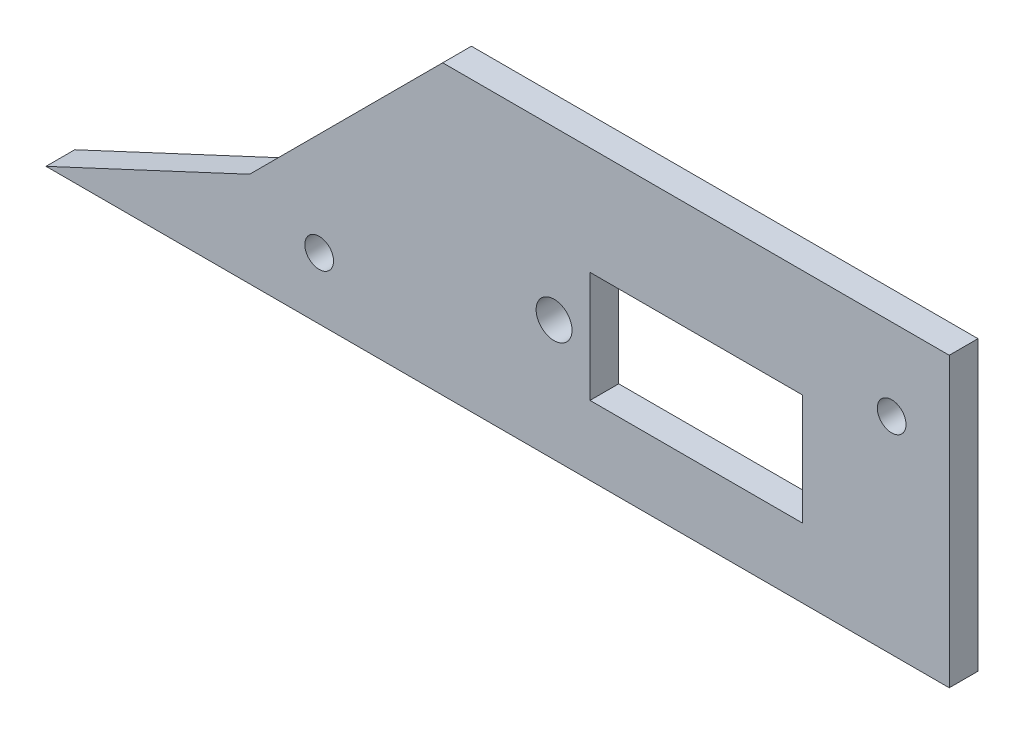
ISO-10303-21;
HEADER;
FILE_DESCRIPTION(('STEP AP214'),'2;1');
FILE_NAME('part.step','',(''),(''),'','','');
FILE_SCHEMA(('AUTOMOTIVE_DESIGN { 1 0 10303 214 1 1 1 1 }'));
ENDSEC;
DATA;
#1=APPLICATION_CONTEXT('core data for automotive mechanical design processes');
#2=APPLICATION_PROTOCOL_DEFINITION('international standard','automotive_design',2000,#1);
#3=PRODUCT_CONTEXT('',#1,'mechanical');
#4=PRODUCT('Part','Part','',(#3));
#5=PRODUCT_RELATED_PRODUCT_CATEGORY('part','',(#4));
#6=PRODUCT_DEFINITION_FORMATION('','',#4);
#7=PRODUCT_DEFINITION_CONTEXT('part definition',#1,'design');
#8=PRODUCT_DEFINITION('design','',#6,#7);
#9=PRODUCT_DEFINITION_SHAPE('','',#8);
#10=(LENGTH_UNIT() NAMED_UNIT(*) SI_UNIT(.MILLI.,.METRE.));
#11=(NAMED_UNIT(*) PLANE_ANGLE_UNIT() SI_UNIT($,.RADIAN.));
#12=(NAMED_UNIT(*) SI_UNIT($,.STERADIAN.) SOLID_ANGLE_UNIT());
#13=UNCERTAINTY_MEASURE_WITH_UNIT(LENGTH_MEASURE(1.E-05),#10,'distance_accuracy_value','');
#14=(GEOMETRIC_REPRESENTATION_CONTEXT(3) GLOBAL_UNCERTAINTY_ASSIGNED_CONTEXT((#13)) GLOBAL_UNIT_ASSIGNED_CONTEXT((#10,
#11,#12)) REPRESENTATION_CONTEXT('',''));
#15=CARTESIAN_POINT('',(0.,0.,0.));
#16=DIRECTION('',(0.,0.,1.));
#17=DIRECTION('',(1.,0.,0.));
#18=AXIS2_PLACEMENT_3D('',#15,#16,#17);
#19=CARTESIAN_POINT('',(0.,0.,2.));
#20=DIRECTION('',(0.,0.,1.));
#21=DIRECTION('',(1.,0.,0.));
#22=AXIS2_PLACEMENT_3D('',#19,#20,#21);
#23=PLANE('',#22);
#24=CARTESIAN_POINT('',(-28.8454583846167,-44.7100503276765,2.));
#25=DIRECTION('',(0.,0.,1.));
#26=DIRECTION('',(1.,0.,0.));
#27=AXIS2_PLACEMENT_3D('',#24,#25,#26);
#28=CIRCLE('',#27,1.);
#29=CARTESIAN_POINT('',(-27.8454583846167,-44.7100503276765,2.));
#30=VERTEX_POINT('',#29);
#31=EDGE_CURVE('E133',#30,#30,#28,.T.);
#32=ORIENTED_EDGE('',*,*,#31,.F.);
#33=EDGE_LOOP('',(#32));
#34=FACE_BOUND('',#33,.T.);
#35=DIRECTION('',(1.,0.,0.));
#36=VECTOR('',#35,1.);
#37=CARTESIAN_POINT('',(-47.8554930794905,-49.,2.));
#38=LINE('',#37,#36);
#39=CARTESIAN_POINT('',(-47.8554930794905,-49.,2.));
#40=VERTEX_POINT('',#39);
#41=CARTESIAN_POINT('',(15.,-49.,2.));
#42=VERTEX_POINT('',#41);
#43=EDGE_CURVE('E149',#40,#42,#38,.T.);
#44=ORIENTED_EDGE('',*,*,#43,.T.);
#45=DIRECTION('',(0.,1.,0.));
#46=VECTOR('',#45,1.);
#47=CARTESIAN_POINT('',(15.,-49.,2.));
#48=LINE('',#47,#46);
#49=CARTESIAN_POINT('',(15.,-28.957842446123,2.));
#50=VERTEX_POINT('',#49);
#51=EDGE_CURVE('E152',#42,#50,#48,.T.);
#52=ORIENTED_EDGE('',*,*,#51,.T.);
#53=DIRECTION('',(-1.,0.,0.));
#54=VECTOR('',#53,1.);
#55=CARTESIAN_POINT('',(15.,-28.957842446123,2.));
#56=LINE('',#55,#54);
#57=CARTESIAN_POINT('',(-20.2514309907959,-28.957842446123,2.));
#58=VERTEX_POINT('',#57);
#59=EDGE_CURVE('E155',#50,#58,#56,.T.);
#60=ORIENTED_EDGE('',*,*,#59,.T.);
#61=DIRECTION('',(-0.707106781186546,-0.707106781186549,0.));
#62=VECTOR('',#61,1.);
#63=CARTESIAN_POINT('',(-20.2514309907959,-28.957842446123,2.));
#64=LINE('',#63,#62);
#65=CARTESIAN_POINT('',(-33.6864598333403,-42.3928712886674,2.));
#66=VERTEX_POINT('',#65);
#67=EDGE_CURVE('E157',#58,#66,#64,.T.);
#68=ORIENTED_EDGE('',*,*,#67,.T.);
#69=DIRECTION('',(-0.906307787036649,-0.422618261740701,0.));
#70=VECTOR('',#69,1.);
#71=CARTESIAN_POINT('',(-33.6864598333403,-42.3928712886674,2.));
#72=LINE('',#71,#70);
#73=EDGE_CURVE('E159',#66,#40,#72,.T.);
#74=ORIENTED_EDGE('',*,*,#73,.T.);
#75=EDGE_LOOP('',(#44,#52,#60,#68,#74));
#76=FACE_BOUND('',#75,.T.);
#77=CARTESIAN_POINT('',(-12.5000000000006,-40.5789212230615,2.));
#78=DIRECTION('',(0.,0.,1.));
#79=DIRECTION('',(1.,0.,0.));
#80=AXIS2_PLACEMENT_3D('',#77,#78,#79);
#81=CIRCLE('',#80,1.25);
#82=CARTESIAN_POINT('',(-11.2500000000006,-40.5789212230615,2.));
#83=VERTEX_POINT('',#82);
#84=EDGE_CURVE('E143',#83,#83,#81,.T.);
#85=ORIENTED_EDGE('',*,*,#84,.F.);
#86=EDGE_LOOP('',(#85));
#87=FACE_BOUND('',#86,.T.);
#88=DIRECTION('',(1.,0.,0.));
#89=VECTOR('',#88,1.);
#90=CARTESIAN_POINT('',(-10.0000000000007,-44.1789212230615,2.));
#91=LINE('',#90,#89);
#92=CARTESIAN_POINT('',(-10.0000000000007,-44.1789212230615,2.));
#93=VERTEX_POINT('',#92);
#94=CARTESIAN_POINT('',(4.79827681260367,-44.1789212230615,2.));
#95=VERTEX_POINT('',#94);
#96=EDGE_CURVE('E109',#93,#95,#91,.T.);
#97=ORIENTED_EDGE('',*,*,#96,.F.);
#98=DIRECTION('',(0.,-1.,0.));
#99=VECTOR('',#98,1.);
#100=CARTESIAN_POINT('',(-10.0000000000007,-36.4599849984195,2.));
#101=LINE('',#100,#99);
#102=CARTESIAN_POINT('',(-10.0000000000007,-36.4599849984195,2.));
#103=VERTEX_POINT('',#102);
#104=EDGE_CURVE('E101',#103,#93,#101,.T.);
#105=ORIENTED_EDGE('',*,*,#104,.F.);
#106=DIRECTION('',(-1.,0.,0.));
#107=VECTOR('',#106,1.);
#108=CARTESIAN_POINT('',(-10.0000000000007,-36.4599849984195,2.));
#109=LINE('',#108,#107);
#110=CARTESIAN_POINT('',(4.79827681260367,-36.4599849984195,2.));
#111=VERTEX_POINT('',#110);
#112=EDGE_CURVE('E126',#111,#103,#109,.T.);
#113=ORIENTED_EDGE('',*,*,#112,.F.);
#114=DIRECTION('',(0.,1.,0.));
#115=VECTOR('',#114,1.);
#116=CARTESIAN_POINT('',(4.79827681260367,-43.6789212230615,2.));
#117=LINE('',#116,#115);
#118=EDGE_CURVE('E124',#95,#111,#117,.T.);
#119=ORIENTED_EDGE('',*,*,#118,.F.);
#120=EDGE_LOOP('',(#97,#105,#113,#119));
#121=FACE_BOUND('',#120,.T.);
#122=CARTESIAN_POINT('',(10.9920877609015,-34.6415626495894,2.));
#123=DIRECTION('',(0.,0.,1.));
#124=DIRECTION('',(1.,0.,0.));
#125=AXIS2_PLACEMENT_3D('',#122,#123,#124);
#126=CIRCLE('',#125,1.);
#127=CARTESIAN_POINT('',(11.9920877609015,-34.6415626495894,2.));
#128=VERTEX_POINT('',#127);
#129=EDGE_CURVE('E337',#128,#128,#126,.T.);
#130=ORIENTED_EDGE('',*,*,#129,.F.);
#131=EDGE_LOOP('',(#130));
#132=FACE_BOUND('',#131,.T.);
#133=ADVANCED_FACE('F32',(#34,#76,#87,#121,#132),#23,.T.);
#134=CARTESIAN_POINT('',(0.,0.,0.));
#135=DIRECTION('',(0.,0.,1.));
#136=DIRECTION('',(1.,0.,0.));
#137=AXIS2_PLACEMENT_3D('',#134,#135,#136);
#138=PLANE('',#137);
#139=CARTESIAN_POINT('',(-12.5000000000006,-40.5789212230615,0.));
#140=DIRECTION('',(0.,0.,1.));
#141=DIRECTION('',(1.,0.,0.));
#142=AXIS2_PLACEMENT_3D('',#139,#140,#141);
#143=CIRCLE('',#142,1.25);
#144=CARTESIAN_POINT('',(-11.2500000000006,-40.5789212230615,0.));
#145=VERTEX_POINT('',#144);
#146=EDGE_CURVE('E119',#145,#145,#143,.T.);
#147=ORIENTED_EDGE('',*,*,#146,.T.);
#148=EDGE_LOOP('',(#147));
#149=FACE_BOUND('',#148,.T.);
#150=DIRECTION('',(1.,0.,0.));
#151=VECTOR('',#150,1.);
#152=CARTESIAN_POINT('',(-47.8554930794905,-49.,0.));
#153=LINE('',#152,#151);
#154=CARTESIAN_POINT('',(-47.8554930794905,-49.,0.));
#155=VERTEX_POINT('',#154);
#156=CARTESIAN_POINT('',(15.,-49.,0.));
#157=VERTEX_POINT('',#156);
#158=EDGE_CURVE('E146',#155,#157,#153,.T.);
#159=ORIENTED_EDGE('',*,*,#158,.F.);
#160=DIRECTION('',(-0.906307787036649,-0.422618261740701,0.));
#161=VECTOR('',#160,1.);
#162=CARTESIAN_POINT('',(-33.6864598333403,-42.3928712886674,0.));
#163=LINE('',#162,#161);
#164=CARTESIAN_POINT('',(-33.6864598333403,-42.3928712886674,0.));
#165=VERTEX_POINT('',#164);
#166=EDGE_CURVE('E153',#165,#155,#163,.T.);
#167=ORIENTED_EDGE('',*,*,#166,.F.);
#168=DIRECTION('',(-0.707106781186546,-0.707106781186549,0.));
#169=VECTOR('',#168,1.);
#170=CARTESIAN_POINT('',(-20.2514309907959,-28.957842446123,0.));
#171=LINE('',#170,#169);
#172=CARTESIAN_POINT('',(-20.2514309907959,-28.957842446123,0.));
#173=VERTEX_POINT('',#172);
#174=EDGE_CURVE('E168',#173,#165,#171,.T.);
#175=ORIENTED_EDGE('',*,*,#174,.F.);
#176=DIRECTION('',(-1.,0.,0.));
#177=VECTOR('',#176,1.);
#178=CARTESIAN_POINT('',(15.,-28.957842446123,0.));
#179=LINE('',#178,#177);
#180=CARTESIAN_POINT('',(15.,-28.957842446123,0.));
#181=VERTEX_POINT('',#180);
#182=EDGE_CURVE('E166',#181,#173,#179,.T.);
#183=ORIENTED_EDGE('',*,*,#182,.F.);
#184=DIRECTION('',(0.,1.,0.));
#185=VECTOR('',#184,1.);
#186=CARTESIAN_POINT('',(15.,-49.,0.));
#187=LINE('',#186,#185);
#188=EDGE_CURVE('E164',#157,#181,#187,.T.);
#189=ORIENTED_EDGE('',*,*,#188,.F.);
#190=EDGE_LOOP('',(#159,#167,#175,#183,#189));
#191=FACE_BOUND('',#190,.T.);
#192=DIRECTION('',(0.,-1.,0.));
#193=VECTOR('',#192,1.);
#194=CARTESIAN_POINT('',(-10.0000000000007,-43.6789212230615,0.));
#195=LINE('',#194,#193);
#196=CARTESIAN_POINT('',(-10.0000000000007,-36.4599849984195,0.));
#197=VERTEX_POINT('',#196);
#198=CARTESIAN_POINT('',(-10.0000000000007,-44.1789212230615,0.));
#199=VERTEX_POINT('',#198);
#200=EDGE_CURVE('E131',#197,#199,#195,.T.);
#201=ORIENTED_EDGE('',*,*,#200,.T.);
#202=DIRECTION('',(1.,0.,0.));
#203=VECTOR('',#202,1.);
#204=CARTESIAN_POINT('',(-10.0000000000007,-44.1789212230615,0.));
#205=LINE('',#204,#203);
#206=CARTESIAN_POINT('',(4.79827681260367,-44.1789212230615,0.));
#207=VERTEX_POINT('',#206);
#208=EDGE_CURVE('E117',#199,#207,#205,.T.);
#209=ORIENTED_EDGE('',*,*,#208,.T.);
#210=DIRECTION('',(0.,1.,0.));
#211=VECTOR('',#210,1.);
#212=CARTESIAN_POINT('',(4.79827681260367,-36.4599849984195,0.));
#213=LINE('',#212,#211);
#214=CARTESIAN_POINT('',(4.79827681260367,-36.4599849984195,0.));
#215=VERTEX_POINT('',#214);
#216=EDGE_CURVE('E135',#207,#215,#213,.T.);
#217=ORIENTED_EDGE('',*,*,#216,.T.);
#218=DIRECTION('',(-1.,0.,0.));
#219=VECTOR('',#218,1.);
#220=CARTESIAN_POINT('',(-10.0000000000007,-36.4599849984195,0.));
#221=LINE('',#220,#219);
#222=EDGE_CURVE('E110',#215,#197,#221,.T.);
#223=ORIENTED_EDGE('',*,*,#222,.T.);
#224=EDGE_LOOP('',(#201,#209,#217,#223));
#225=FACE_BOUND('',#224,.T.);
#226=CARTESIAN_POINT('',(-28.8454583846167,-44.7100503276765,0.));
#227=DIRECTION('',(0.,0.,1.));
#228=DIRECTION('',(1.,0.,0.));
#229=AXIS2_PLACEMENT_3D('',#226,#227,#228);
#230=CIRCLE('',#229,1.);
#231=CARTESIAN_POINT('',(-27.8454583846167,-44.7100503276765,0.));
#232=VERTEX_POINT('',#231);
#233=EDGE_CURVE('E343',#232,#232,#230,.T.);
#234=ORIENTED_EDGE('',*,*,#233,.T.);
#235=EDGE_LOOP('',(#234));
#236=FACE_BOUND('',#235,.T.);
#237=CARTESIAN_POINT('',(10.9920877609015,-34.6415626495894,0.));
#238=DIRECTION('',(0.,0.,1.));
#239=DIRECTION('',(1.,0.,0.));
#240=AXIS2_PLACEMENT_3D('',#237,#238,#239);
#241=CIRCLE('',#240,1.);
#242=CARTESIAN_POINT('',(11.9920877609015,-34.6415626495894,0.));
#243=VERTEX_POINT('',#242);
#244=EDGE_CURVE('E340',#243,#243,#241,.T.);
#245=ORIENTED_EDGE('',*,*,#244,.T.);
#246=EDGE_LOOP('',(#245));
#247=FACE_BOUND('',#246,.T.);
#248=ADVANCED_FACE('F189',(#149,#191,#225,#236,#247),#138,.F.);
#249=CARTESIAN_POINT('',(-47.8554930794905,-49.,2.));
#250=DIRECTION('',(0.,1.,0.));
#251=DIRECTION('',(0.,0.,1.));
#252=AXIS2_PLACEMENT_3D('',#249,#250,#251);
#253=PLANE('',#252);
#254=ORIENTED_EDGE('',*,*,#158,.T.);
#255=DIRECTION('',(0.,0.,-1.));
#256=VECTOR('',#255,1.);
#257=CARTESIAN_POINT('',(15.,-49.,2.));
#258=LINE('',#257,#256);
#259=EDGE_CURVE('E11',#42,#157,#258,.T.);
#260=ORIENTED_EDGE('',*,*,#259,.F.);
#261=ORIENTED_EDGE('',*,*,#43,.F.);
#262=DIRECTION('',(0.,0.,-1.));
#263=VECTOR('',#262,1.);
#264=CARTESIAN_POINT('',(-47.8554930794905,-49.,2.));
#265=LINE('',#264,#263);
#266=EDGE_CURVE('E161',#40,#155,#265,.T.);
#267=ORIENTED_EDGE('',*,*,#266,.T.);
#268=EDGE_LOOP('',(#254,#260,#261,#267));
#269=FACE_BOUND('',#268,.T.);
#270=ADVANCED_FACE('F34',(#269),#253,.F.);
#271=CARTESIAN_POINT('',(15.,-49.,2.));
#272=DIRECTION('',(-1.,0.,0.));
#273=DIRECTION('',(0.,0.,1.));
#274=AXIS2_PLACEMENT_3D('',#271,#272,#273);
#275=PLANE('',#274);
#276=ORIENTED_EDGE('',*,*,#188,.T.);
#277=DIRECTION('',(0.,0.,-1.));
#278=VECTOR('',#277,1.);
#279=CARTESIAN_POINT('',(15.,-28.957842446123,2.));
#280=LINE('',#279,#278);
#281=EDGE_CURVE('E40',#50,#181,#280,.T.);
#282=ORIENTED_EDGE('',*,*,#281,.F.);
#283=ORIENTED_EDGE('',*,*,#51,.F.);
#284=ORIENTED_EDGE('',*,*,#259,.T.);
#285=EDGE_LOOP('',(#276,#282,#283,#284));
#286=FACE_BOUND('',#285,.T.);
#287=ADVANCED_FACE('F204',(#286),#275,.F.);
#288=CARTESIAN_POINT('',(15.,-28.957842446123,2.));
#289=DIRECTION('',(0.,-1.,0.));
#290=DIRECTION('',(1.,0.,0.));
#291=AXIS2_PLACEMENT_3D('',#288,#289,#290);
#292=PLANE('',#291);
#293=ORIENTED_EDGE('',*,*,#182,.T.);
#294=DIRECTION('',(0.,0.,-1.));
#295=VECTOR('',#294,1.);
#296=CARTESIAN_POINT('',(-20.2514309907959,-28.957842446123,2.));
#297=LINE('',#296,#295);
#298=EDGE_CURVE('E176',#58,#173,#297,.T.);
#299=ORIENTED_EDGE('',*,*,#298,.F.);
#300=ORIENTED_EDGE('',*,*,#59,.F.);
#301=ORIENTED_EDGE('',*,*,#281,.T.);
#302=EDGE_LOOP('',(#293,#299,#300,#301));
#303=FACE_BOUND('',#302,.T.);
#304=ADVANCED_FACE('F183',(#303),#292,.F.);
#305=CARTESIAN_POINT('',(-20.2514309907959,-28.957842446123,2.));
#306=DIRECTION('',(0.707106781186549,-0.707106781186546,0.));
#307=DIRECTION('',(0.707106781186546,0.707106781186549,0.));
#308=AXIS2_PLACEMENT_3D('',#305,#306,#307);
#309=PLANE('',#308);
#310=ORIENTED_EDGE('',*,*,#174,.T.);
#311=DIRECTION('',(0.,0.,-1.));
#312=VECTOR('',#311,1.);
#313=CARTESIAN_POINT('',(-33.6864598333403,-42.3928712886674,2.));
#314=LINE('',#313,#312);
#315=EDGE_CURVE('E173',#66,#165,#314,.T.);
#316=ORIENTED_EDGE('',*,*,#315,.F.);
#317=ORIENTED_EDGE('',*,*,#67,.F.);
#318=ORIENTED_EDGE('',*,*,#298,.T.);
#319=EDGE_LOOP('',(#310,#316,#317,#318));
#320=FACE_BOUND('',#319,.T.);
#321=ADVANCED_FACE('F194',(#320),#309,.F.);
#322=CARTESIAN_POINT('',(-33.6864598333403,-42.3928712886674,2.));
#323=DIRECTION('',(0.422618261740701,-0.906307787036649,0.));
#324=DIRECTION('',(0.906307787036649,0.422618261740701,0.));
#325=AXIS2_PLACEMENT_3D('',#322,#323,#324);
#326=PLANE('',#325);
#327=ORIENTED_EDGE('',*,*,#166,.T.);
#328=ORIENTED_EDGE('',*,*,#266,.F.);
#329=ORIENTED_EDGE('',*,*,#73,.F.);
#330=ORIENTED_EDGE('',*,*,#315,.T.);
#331=EDGE_LOOP('',(#327,#328,#329,#330));
#332=FACE_BOUND('',#331,.T.);
#333=ADVANCED_FACE('F198',(#332),#326,.F.);
#334=CARTESIAN_POINT('',(-12.5000000000006,-40.5789212230615,2.));
#335=DIRECTION('',(0.,0.,-1.));
#336=DIRECTION('',(-1.,0.,0.));
#337=AXIS2_PLACEMENT_3D('',#334,#335,#336);
#338=CYLINDRICAL_SURFACE('',#337,1.25);
#339=ORIENTED_EDGE('',*,*,#84,.T.);
#340=EDGE_LOOP('',(#339));
#341=FACE_BOUND('',#340,.T.);
#342=ORIENTED_EDGE('',*,*,#146,.F.);
#343=EDGE_LOOP('',(#342));
#344=FACE_BOUND('',#343,.T.);
#345=ADVANCED_FACE('F220',(#341,#344),#338,.F.);
#346=CARTESIAN_POINT('',(-10.0000000000007,-43.6789212230615,2.));
#347=DIRECTION('',(1.,0.,0.));
#348=DIRECTION('',(0.,1.,0.));
#349=AXIS2_PLACEMENT_3D('',#346,#347,#348);
#350=PLANE('',#349);
#351=ORIENTED_EDGE('',*,*,#200,.F.);
#352=DIRECTION('',(0.,0.,-1.));
#353=VECTOR('',#352,1.);
#354=CARTESIAN_POINT('',(-10.0000000000007,-36.4599849984195,2.));
#355=LINE('',#354,#353);
#356=EDGE_CURVE('E52',#103,#197,#355,.T.);
#357=ORIENTED_EDGE('',*,*,#356,.F.);
#358=ORIENTED_EDGE('',*,*,#104,.T.);
#359=DIRECTION('',(0.,0.,-1.));
#360=VECTOR('',#359,1.);
#361=CARTESIAN_POINT('',(-10.0000000000007,-44.1789212230615,2.));
#362=LINE('',#361,#360);
#363=EDGE_CURVE('E104',#93,#199,#362,.T.);
#364=ORIENTED_EDGE('',*,*,#363,.T.);
#365=EDGE_LOOP('',(#351,#357,#358,#364));
#366=FACE_BOUND('',#365,.T.);
#367=ADVANCED_FACE('F103',(#366),#350,.T.);
#368=CARTESIAN_POINT('',(-10.0000000000007,-44.1789212230615,2.));
#369=DIRECTION('',(0.,1.,0.));
#370=DIRECTION('',(0.,0.,1.));
#371=AXIS2_PLACEMENT_3D('',#368,#369,#370);
#372=PLANE('',#371);
#373=ORIENTED_EDGE('',*,*,#208,.F.);
#374=ORIENTED_EDGE('',*,*,#363,.F.);
#375=ORIENTED_EDGE('',*,*,#96,.T.);
#376=DIRECTION('',(0.,0.,-1.));
#377=VECTOR('',#376,1.);
#378=CARTESIAN_POINT('',(4.79827681260367,-44.1789212230615,2.));
#379=LINE('',#378,#377);
#380=EDGE_CURVE('E120',#95,#207,#379,.T.);
#381=ORIENTED_EDGE('',*,*,#380,.T.);
#382=EDGE_LOOP('',(#373,#374,#375,#381));
#383=FACE_BOUND('',#382,.T.);
#384=ADVANCED_FACE('F113',(#383),#372,.T.);
#385=CARTESIAN_POINT('',(4.79827681260367,-36.4599849984195,2.));
#386=DIRECTION('',(-1.,0.,0.));
#387=DIRECTION('',(0.,0.,1.));
#388=AXIS2_PLACEMENT_3D('',#385,#386,#387);
#389=PLANE('',#388);
#390=ORIENTED_EDGE('',*,*,#216,.F.);
#391=ORIENTED_EDGE('',*,*,#380,.F.);
#392=ORIENTED_EDGE('',*,*,#118,.T.);
#393=DIRECTION('',(0.,0.,-1.));
#394=VECTOR('',#393,1.);
#395=CARTESIAN_POINT('',(4.79827681260367,-36.4599849984195,2.));
#396=LINE('',#395,#394);
#397=EDGE_CURVE('E47',#111,#215,#396,.T.);
#398=ORIENTED_EDGE('',*,*,#397,.T.);
#399=EDGE_LOOP('',(#390,#391,#392,#398));
#400=FACE_BOUND('',#399,.T.);
#401=ADVANCED_FACE('F257',(#400),#389,.T.);
#402=CARTESIAN_POINT('',(-10.0000000000007,-36.4599849984195,2.));
#403=DIRECTION('',(0.,-1.,0.));
#404=DIRECTION('',(0.,0.,-1.));
#405=AXIS2_PLACEMENT_3D('',#402,#403,#404);
#406=PLANE('',#405);
#407=ORIENTED_EDGE('',*,*,#222,.F.);
#408=ORIENTED_EDGE('',*,*,#397,.F.);
#409=ORIENTED_EDGE('',*,*,#112,.T.);
#410=ORIENTED_EDGE('',*,*,#356,.T.);
#411=EDGE_LOOP('',(#407,#408,#409,#410));
#412=FACE_BOUND('',#411,.T.);
#413=ADVANCED_FACE('F264',(#412),#406,.T.);
#414=CARTESIAN_POINT('',(-28.8454583846167,-44.7100503276765,2.));
#415=DIRECTION('',(0.,0.,-1.));
#416=DIRECTION('',(-1.,0.,0.));
#417=AXIS2_PLACEMENT_3D('',#414,#415,#416);
#418=CYLINDRICAL_SURFACE('',#417,1.);
#419=ORIENTED_EDGE('',*,*,#31,.T.);
#420=EDGE_LOOP('',(#419));
#421=FACE_BOUND('',#420,.T.);
#422=ORIENTED_EDGE('',*,*,#233,.F.);
#423=EDGE_LOOP('',(#422));
#424=FACE_BOUND('',#423,.T.);
#425=ADVANCED_FACE('F272',(#421,#424),#418,.F.);
#426=CARTESIAN_POINT('',(10.9920877609015,-34.6415626495894,2.));
#427=DIRECTION('',(0.,0.,-1.));
#428=DIRECTION('',(-1.,0.,0.));
#429=AXIS2_PLACEMENT_3D('',#426,#427,#428);
#430=CYLINDRICAL_SURFACE('',#429,1.);
#431=ORIENTED_EDGE('',*,*,#129,.T.);
#432=EDGE_LOOP('',(#431));
#433=FACE_BOUND('',#432,.T.);
#434=ORIENTED_EDGE('',*,*,#244,.F.);
#435=EDGE_LOOP('',(#434));
#436=FACE_BOUND('',#435,.T.);
#437=ADVANCED_FACE('F279',(#433,#436),#430,.F.);
#438=CLOSED_SHELL('',(#133,#248,#270,#287,#304,#321,#333,#345,#367,#384,#401,#413,#425,#437));
#439=MANIFOLD_SOLID_BREP('B2',#438);
#440=ADVANCED_BREP_SHAPE_REPRESENTATION('',(#18,#439),#14);
#441=SHAPE_DEFINITION_REPRESENTATION(#9,#440);
ENDSEC;
END-ISO-10303-21;
